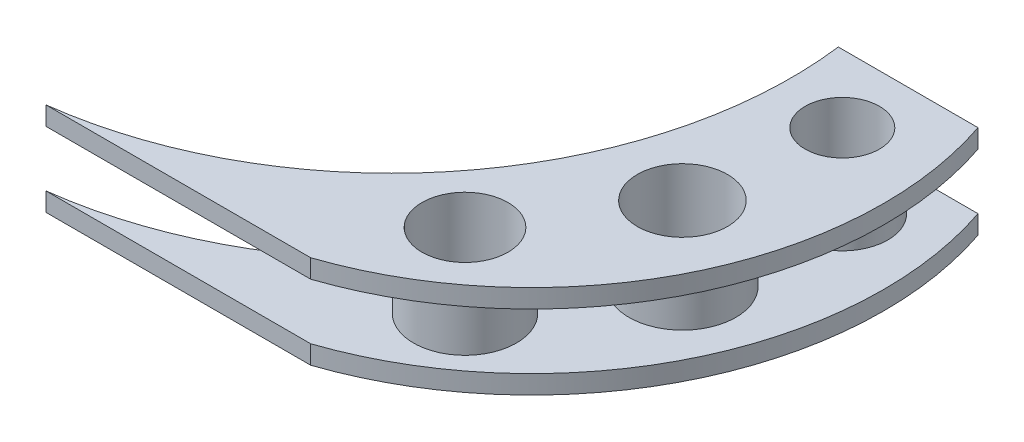
ISO-10303-21;
HEADER;
FILE_DESCRIPTION(('STEP AP214'),'2;1');
FILE_NAME('part.step','',(''),(''),'','','');
FILE_SCHEMA(('AUTOMOTIVE_DESIGN { 1 0 10303 214 1 1 1 1 }'));
ENDSEC;
DATA;
#1=APPLICATION_CONTEXT('core data for automotive mechanical design processes');
#2=APPLICATION_PROTOCOL_DEFINITION('international standard','automotive_design',2000,#1);
#3=PRODUCT_CONTEXT('',#1,'mechanical');
#4=PRODUCT('Part','Part','',(#3));
#5=PRODUCT_RELATED_PRODUCT_CATEGORY('part','',(#4));
#6=PRODUCT_DEFINITION_FORMATION('','',#4);
#7=PRODUCT_DEFINITION_CONTEXT('part definition',#1,'design');
#8=PRODUCT_DEFINITION('design','',#6,#7);
#9=PRODUCT_DEFINITION_SHAPE('','',#8);
#10=(LENGTH_UNIT() NAMED_UNIT(*) SI_UNIT(.MILLI.,.METRE.));
#11=(NAMED_UNIT(*) PLANE_ANGLE_UNIT() SI_UNIT($,.RADIAN.));
#12=(NAMED_UNIT(*) SI_UNIT($,.STERADIAN.) SOLID_ANGLE_UNIT());
#13=UNCERTAINTY_MEASURE_WITH_UNIT(LENGTH_MEASURE(1.E-05),#10,'distance_accuracy_value','');
#14=(GEOMETRIC_REPRESENTATION_CONTEXT(3) GLOBAL_UNCERTAINTY_ASSIGNED_CONTEXT((#13)) GLOBAL_UNIT_ASSIGNED_CONTEXT((#10,
#11,#12)) REPRESENTATION_CONTEXT('',''));
#15=CARTESIAN_POINT('',(0.,0.,0.));
#16=DIRECTION('',(0.,0.,1.));
#17=DIRECTION('',(1.,0.,0.));
#18=AXIS2_PLACEMENT_3D('',#15,#16,#17);
#19=CARTESIAN_POINT('',(-15.8234520425604,8.46666666666667,10.7767821999999));
#20=DIRECTION('',(0.,-1.,0.));
#21=DIRECTION('',(0.,0.,-1.));
#22=AXIS2_PLACEMENT_3D('',#19,#20,#21);
#23=PLANE('',#22);
#24=CARTESIAN_POINT('',(189.259581589069,8.46666666666667,83.8437988648439));
#25=DIRECTION('',(0.,-1.,0.));
#26=DIRECTION('',(0.,0.,-1.));
#27=AXIS2_PLACEMENT_3D('',#24,#25,#26);
#28=CIRCLE('',#27,24.3222874946335);
#29=CARTESIAN_POINT('',(189.259581589069,8.46666666666667,59.5215113702104));
#30=VERTEX_POINT('',#29);
#31=EDGE_CURVE('E60',#30,#30,#28,.F.);
#32=ORIENTED_EDGE('',*,*,#31,.F.);
#33=EDGE_LOOP('',(#32));
#34=FACE_BOUND('',#33,.T.);
#35=CARTESIAN_POINT('',(-15.8234520425604,8.46666666666667,10.7767821999999));
#36=DIRECTION('',(0.,-1.,0.));
#37=DIRECTION('',(0.,0.,-1.));
#38=AXIS2_PLACEMENT_3D('',#35,#36,#37);
#39=CIRCLE('',#38,181.522023150409);
#40=CARTESIAN_POINT('',(164.261221291976,8.46666666666667,-12.0213606763633));
#41=VERTEX_POINT('',#40);
#42=CARTESIAN_POINT('',(6.97469083380382,8.46666666666667,190.861455534536));
#43=VERTEX_POINT('',#42);
#44=EDGE_CURVE('E194',#41,#43,#39,.T.);
#45=ORIENTED_EDGE('',*,*,#44,.T.);
#46=DIRECTION('',(0.999999999999998,0.,6.39674270768674E-08));
#47=VECTOR('',#46,1.);
#48=CARTESIAN_POINT('',(6.97469083380382,8.46666666666667,190.861455534536));
#49=LINE('',#48,#47);
#50=CARTESIAN_POINT('',(127.314749354572,8.46666666666667,190.86146323238));
#51=VERTEX_POINT('',#50);
#52=EDGE_CURVE('E100',#43,#51,#49,.T.);
#53=ORIENTED_EDGE('',*,*,#52,.T.);
#54=CARTESIAN_POINT('',(76.0965733649999,8.46666666666667,39.1968153073744));
#55=DIRECTION('',(0.,1.,0.));
#56=DIRECTION('',(0.,0.,-1.));
#57=AXIS2_PLACEMENT_3D('',#54,#55,#56);
#58=CIRCLE('',#57,160.079564535623);
#59=CARTESIAN_POINT('',(227.761221291975,8.46666666666667,-12.0213606763633));
#60=VERTEX_POINT('',#59);
#61=EDGE_CURVE('E197',#51,#60,#58,.T.);
#62=ORIENTED_EDGE('',*,*,#61,.T.);
#63=DIRECTION('',(-1.,0.,0.));
#64=VECTOR('',#63,1.);
#65=CARTESIAN_POINT('',(164.261221291976,8.46666666666667,-12.0213606763633));
#66=LINE('',#65,#64);
#67=EDGE_CURVE('E68',#60,#41,#66,.T.);
#68=ORIENTED_EDGE('',*,*,#67,.T.);
#69=EDGE_LOOP('',(#45,#53,#62,#68));
#70=FACE_BOUND('',#69,.T.);
#71=CARTESIAN_POINT('',(150.41809926289,8.46666666666667,143.836583447852));
#72=DIRECTION('',(0.,-1.,0.));
#73=DIRECTION('',(0.,0.,-1.));
#74=AXIS2_PLACEMENT_3D('',#71,#72,#73);
#75=CIRCLE('',#74,23.3829417214132);
#76=CARTESIAN_POINT('',(150.41809926289,8.46666666666667,120.453641726439));
#77=VERTEX_POINT('',#76);
#78=EDGE_CURVE('E214',#77,#77,#75,.F.);
#79=ORIENTED_EDGE('',*,*,#78,.F.);
#80=EDGE_LOOP('',(#79));
#81=FACE_BOUND('',#80,.T.);
#82=CARTESIAN_POINT('',(196.950964227916,8.46666666666667,18.8516155665848));
#83=DIRECTION('',(0.,-1.,0.));
#84=DIRECTION('',(0.,0.,-1.));
#85=AXIS2_PLACEMENT_3D('',#82,#83,#84);
#86=CIRCLE('',#85,20.6953940850481);
#87=CARTESIAN_POINT('',(196.950964227916,8.46666666666667,-1.84377851846334));
#88=VERTEX_POINT('',#87);
#89=EDGE_CURVE('E12',#88,#88,#86,.F.);
#90=ORIENTED_EDGE('',*,*,#89,.F.);
#91=EDGE_LOOP('',(#90));
#92=FACE_BOUND('',#91,.T.);
#93=ADVANCED_FACE('F51',(#34,#70,#81,#92),#23,.F.);
#94=CARTESIAN_POINT('',(-15.8234520425604,8.46666666666667,10.7767821999999));
#95=DIRECTION('',(0.,-1.,0.));
#96=DIRECTION('',(0.,0.,-1.));
#97=AXIS2_PLACEMENT_3D('',#94,#95,#96);
#98=CYLINDRICAL_SURFACE('',#97,181.522023150409);
#99=CARTESIAN_POINT('',(-15.8234520425604,0.,10.7767821999999));
#100=DIRECTION('',(0.,-1.,0.));
#101=DIRECTION('',(0.,0.,-1.));
#102=AXIS2_PLACEMENT_3D('',#99,#100,#101);
#103=CIRCLE('',#102,181.522023150409);
#104=CARTESIAN_POINT('',(164.261221291976,0.,-12.0213606763633));
#105=VERTEX_POINT('',#104);
#106=CARTESIAN_POINT('',(6.97469083380382,0.,190.861455534536));
#107=VERTEX_POINT('',#106);
#108=EDGE_CURVE('E193',#105,#107,#103,.T.);
#109=ORIENTED_EDGE('',*,*,#108,.T.);
#110=DIRECTION('',(0.,-1.,0.));
#111=VECTOR('',#110,1.);
#112=CARTESIAN_POINT('',(6.97469083380382,8.46666666666667,190.861455534536));
#113=LINE('',#112,#111);
#114=EDGE_CURVE('E212',#43,#107,#113,.T.);
#115=ORIENTED_EDGE('',*,*,#114,.F.);
#116=ORIENTED_EDGE('',*,*,#44,.F.);
#117=DIRECTION('',(0.,-1.,0.));
#118=VECTOR('',#117,1.);
#119=CARTESIAN_POINT('',(164.261221291976,8.46666666666667,-12.0213606763633));
#120=LINE('',#119,#118);
#121=EDGE_CURVE('E200',#41,#105,#120,.T.);
#122=ORIENTED_EDGE('',*,*,#121,.T.);
#123=EDGE_LOOP('',(#109,#115,#116,#122));
#124=FACE_BOUND('',#123,.T.);
#125=ADVANCED_FACE('F53',(#124),#98,.F.);
#126=CARTESIAN_POINT('',(6.97469083380382,8.46666666666667,190.861455534536));
#127=DIRECTION('',(6.39674270768674E-08,0.,-0.999999999999998));
#128=DIRECTION('',(-0.999999999999998,0.,-6.39674270768674E-08));
#129=AXIS2_PLACEMENT_3D('',#126,#127,#128);
#130=PLANE('',#129);
#131=DIRECTION('',(0.999999999999998,0.,6.39674270768674E-08));
#132=VECTOR('',#131,1.);
#133=CARTESIAN_POINT('',(6.97469083380382,0.,190.861455534536));
#134=LINE('',#133,#132);
#135=CARTESIAN_POINT('',(127.314749354572,0.,190.86146323238));
#136=VERTEX_POINT('',#135);
#137=EDGE_CURVE('E203',#107,#136,#134,.T.);
#138=ORIENTED_EDGE('',*,*,#137,.T.);
#139=DIRECTION('',(0.,-1.,0.));
#140=VECTOR('',#139,1.);
#141=CARTESIAN_POINT('',(127.314749354572,8.46666666666667,190.86146323238));
#142=LINE('',#141,#140);
#143=EDGE_CURVE('E210',#51,#136,#142,.T.);
#144=ORIENTED_EDGE('',*,*,#143,.F.);
#145=ORIENTED_EDGE('',*,*,#52,.F.);
#146=ORIENTED_EDGE('',*,*,#114,.T.);
#147=EDGE_LOOP('',(#138,#144,#145,#146));
#148=FACE_BOUND('',#147,.T.);
#149=ADVANCED_FACE('F286',(#148),#130,.F.);
#150=CARTESIAN_POINT('',(76.0965733649999,8.46666666666667,39.1968153073744));
#151=DIRECTION('',(0.,-1.,0.));
#152=DIRECTION('',(0.,0.,-1.));
#153=AXIS2_PLACEMENT_3D('',#150,#151,#152);
#154=CYLINDRICAL_SURFACE('',#153,160.079564535623);
#155=CARTESIAN_POINT('',(76.0965733649999,0.,39.1968153073744));
#156=DIRECTION('',(0.,1.,0.));
#157=DIRECTION('',(0.,0.,-1.));
#158=AXIS2_PLACEMENT_3D('',#155,#156,#157);
#159=CIRCLE('',#158,160.079564535623);
#160=CARTESIAN_POINT('',(227.761221291975,0.,-12.0213606763633));
#161=VERTEX_POINT('',#160);
#162=EDGE_CURVE('E86',#136,#161,#159,.T.);
#163=ORIENTED_EDGE('',*,*,#162,.T.);
#164=DIRECTION('',(0.,-1.,0.));
#165=VECTOR('',#164,1.);
#166=CARTESIAN_POINT('',(227.761221291975,8.46666666666667,-12.0213606763633));
#167=LINE('',#166,#165);
#168=EDGE_CURVE('E208',#60,#161,#167,.T.);
#169=ORIENTED_EDGE('',*,*,#168,.F.);
#170=ORIENTED_EDGE('',*,*,#61,.F.);
#171=ORIENTED_EDGE('',*,*,#143,.T.);
#172=EDGE_LOOP('',(#163,#169,#170,#171));
#173=FACE_BOUND('',#172,.T.);
#174=ADVANCED_FACE('F284',(#173),#154,.T.);
#175=CARTESIAN_POINT('',(164.261221291976,8.46666666666667,-12.0213606763633));
#176=DIRECTION('',(0.,0.,1.));
#177=DIRECTION('',(1.,0.,0.));
#178=AXIS2_PLACEMENT_3D('',#175,#176,#177);
#179=PLANE('',#178);
#180=DIRECTION('',(-1.,0.,0.));
#181=VECTOR('',#180,1.);
#182=CARTESIAN_POINT('',(164.261221291976,0.,-12.0213606763633));
#183=LINE('',#182,#181);
#184=EDGE_CURVE('E92',#161,#105,#183,.T.);
#185=ORIENTED_EDGE('',*,*,#184,.T.);
#186=ORIENTED_EDGE('',*,*,#121,.F.);
#187=ORIENTED_EDGE('',*,*,#67,.F.);
#188=ORIENTED_EDGE('',*,*,#168,.T.);
#189=EDGE_LOOP('',(#185,#186,#187,#188));
#190=FACE_BOUND('',#189,.T.);
#191=ADVANCED_FACE('F280',(#190),#179,.F.);
#192=CARTESIAN_POINT('',(-15.8234520425604,0.,10.7767821999999));
#193=DIRECTION('',(0.,-1.,0.));
#194=DIRECTION('',(0.,0.,-1.));
#195=AXIS2_PLACEMENT_3D('',#192,#193,#194);
#196=PLANE('',#195);
#197=CARTESIAN_POINT('',(150.41809926289,0.,143.836583447852));
#198=DIRECTION('',(0.,1.,0.));
#199=DIRECTION('',(0.,0.,1.));
#200=AXIS2_PLACEMENT_3D('',#197,#198,#199);
#201=CIRCLE('',#200,19.5729417214132);
#202=CARTESIAN_POINT('',(150.41809926289,0.,163.409525169266));
#203=VERTEX_POINT('',#202);
#204=EDGE_CURVE('E184',#203,#203,#201,.T.);
#205=ORIENTED_EDGE('',*,*,#204,.T.);
#206=EDGE_LOOP('',(#205));
#207=FACE_BOUND('',#206,.T.);
#208=CARTESIAN_POINT('',(189.259581589069,0.,83.8437988648439));
#209=DIRECTION('',(0.,1.,0.));
#210=DIRECTION('',(0.,0.,1.));
#211=AXIS2_PLACEMENT_3D('',#208,#209,#210);
#212=CIRCLE('',#211,20.5122874946335);
#213=CARTESIAN_POINT('',(189.259581589069,0.,104.356086359477));
#214=VERTEX_POINT('',#213);
#215=EDGE_CURVE('E187',#214,#214,#212,.T.);
#216=ORIENTED_EDGE('',*,*,#215,.T.);
#217=EDGE_LOOP('',(#216));
#218=FACE_BOUND('',#217,.T.);
#219=CARTESIAN_POINT('',(196.950964227916,0.,18.8516155665848));
#220=DIRECTION('',(0.,1.,0.));
#221=DIRECTION('',(0.,0.,1.));
#222=AXIS2_PLACEMENT_3D('',#219,#220,#221);
#223=CIRCLE('',#222,16.8853940850481);
#224=CARTESIAN_POINT('',(196.950964227916,0.,35.7370096516329));
#225=VERTEX_POINT('',#224);
#226=EDGE_CURVE('E190',#225,#225,#223,.T.);
#227=ORIENTED_EDGE('',*,*,#226,.T.);
#228=EDGE_LOOP('',(#227));
#229=FACE_BOUND('',#228,.T.);
#230=ORIENTED_EDGE('',*,*,#108,.F.);
#231=ORIENTED_EDGE('',*,*,#184,.F.);
#232=ORIENTED_EDGE('',*,*,#162,.F.);
#233=ORIENTED_EDGE('',*,*,#137,.F.);
#234=EDGE_LOOP('',(#230,#231,#232,#233));
#235=FACE_BOUND('',#234,.T.);
#236=ADVANCED_FACE('F275',(#207,#218,#229,#235),#196,.T.);
#237=CARTESIAN_POINT('',(196.950964227916,0.,18.8516155665848));
#238=DIRECTION('',(0.,1.,0.));
#239=DIRECTION('',(0.,0.,1.));
#240=AXIS2_PLACEMENT_3D('',#237,#238,#239);
#241=CYLINDRICAL_SURFACE('',#240,16.8853940850481);
#242=ORIENTED_EDGE('',*,*,#226,.F.);
#243=EDGE_LOOP('',(#242));
#244=FACE_BOUND('',#243,.T.);
#245=CARTESIAN_POINT('',(196.950964227916,42.3333333333333,18.8516155665848));
#246=DIRECTION('',(0.,1.,0.));
#247=DIRECTION('',(0.,0.,1.));
#248=AXIS2_PLACEMENT_3D('',#245,#246,#247);
#249=CIRCLE('',#248,16.8853940850481);
#250=CARTESIAN_POINT('',(196.950964227916,42.3333333333333,35.7370096516329));
#251=VERTEX_POINT('',#250);
#252=EDGE_CURVE('E160',#251,#251,#249,.T.);
#253=ORIENTED_EDGE('',*,*,#252,.T.);
#254=EDGE_LOOP('',(#253));
#255=FACE_BOUND('',#254,.T.);
#256=ADVANCED_FACE('F272',(#244,#255),#241,.F.);
#257=CARTESIAN_POINT('',(189.259581589069,0.,83.8437988648439));
#258=DIRECTION('',(0.,1.,0.));
#259=DIRECTION('',(0.,0.,1.));
#260=AXIS2_PLACEMENT_3D('',#257,#258,#259);
#261=CYLINDRICAL_SURFACE('',#260,20.5122874946335);
#262=ORIENTED_EDGE('',*,*,#215,.F.);
#263=EDGE_LOOP('',(#262));
#264=FACE_BOUND('',#263,.T.);
#265=CARTESIAN_POINT('',(189.259581589069,42.3333333333333,83.8437988648439));
#266=DIRECTION('',(0.,1.,0.));
#267=DIRECTION('',(0.,0.,1.));
#268=AXIS2_PLACEMENT_3D('',#265,#266,#267);
#269=CIRCLE('',#268,20.5122874946335);
#270=CARTESIAN_POINT('',(189.259581589069,42.3333333333333,104.356086359477));
#271=VERTEX_POINT('',#270);
#272=EDGE_CURVE('E417',#271,#271,#269,.T.);
#273=ORIENTED_EDGE('',*,*,#272,.T.);
#274=EDGE_LOOP('',(#273));
#275=FACE_BOUND('',#274,.T.);
#276=ADVANCED_FACE('F268',(#264,#275),#261,.F.);
#277=CARTESIAN_POINT('',(150.41809926289,0.,143.836583447852));
#278=DIRECTION('',(0.,1.,0.));
#279=DIRECTION('',(0.,0.,1.));
#280=AXIS2_PLACEMENT_3D('',#277,#278,#279);
#281=CYLINDRICAL_SURFACE('',#280,19.5729417214132);
#282=ORIENTED_EDGE('',*,*,#204,.F.);
#283=EDGE_LOOP('',(#282));
#284=FACE_BOUND('',#283,.T.);
#285=CARTESIAN_POINT('',(150.41809926289,42.3333333333333,143.836583447852));
#286=DIRECTION('',(0.,1.,0.));
#287=DIRECTION('',(0.,0.,1.));
#288=AXIS2_PLACEMENT_3D('',#285,#286,#287);
#289=CIRCLE('',#288,19.5729417214132);
#290=CARTESIAN_POINT('',(150.41809926289,42.3333333333333,163.409525169266));
#291=VERTEX_POINT('',#290);
#292=EDGE_CURVE('E419',#291,#291,#289,.T.);
#293=ORIENTED_EDGE('',*,*,#292,.T.);
#294=EDGE_LOOP('',(#293));
#295=FACE_BOUND('',#294,.T.);
#296=ADVANCED_FACE('F264',(#284,#295),#281,.F.);
#297=CARTESIAN_POINT('',(150.41809926289,21.1666666666667,143.836583447852));
#298=DIRECTION('',(0.,-1.,0.));
#299=DIRECTION('',(0.,0.,-1.));
#300=AXIS2_PLACEMENT_3D('',#297,#298,#299);
#301=CYLINDRICAL_SURFACE('',#300,23.3829417214132);
#302=ORIENTED_EDGE('',*,*,#78,.T.);
#303=EDGE_LOOP('',(#302));
#304=FACE_BOUND('',#303,.T.);
#305=CARTESIAN_POINT('',(150.41809926289,33.8666666666667,143.836583447852));
#306=DIRECTION('',(0.,-1.,0.));
#307=DIRECTION('',(0.,0.,-1.));
#308=AXIS2_PLACEMENT_3D('',#305,#306,#307);
#309=CIRCLE('',#308,23.3829417214132);
#310=CARTESIAN_POINT('',(150.41809926289,33.8666666666667,120.453641726439));
#311=VERTEX_POINT('',#310);
#312=EDGE_CURVE('E139',#311,#311,#309,.F.);
#313=ORIENTED_EDGE('',*,*,#312,.F.);
#314=EDGE_LOOP('',(#313));
#315=FACE_BOUND('',#314,.T.);
#316=ADVANCED_FACE('F261',(#304,#315),#301,.T.);
#317=CARTESIAN_POINT('',(189.259581589069,21.1666666666667,83.8437988648439));
#318=DIRECTION('',(0.,-1.,0.));
#319=DIRECTION('',(0.,0.,-1.));
#320=AXIS2_PLACEMENT_3D('',#317,#318,#319);
#321=CYLINDRICAL_SURFACE('',#320,24.3222874946335);
#322=ORIENTED_EDGE('',*,*,#31,.T.);
#323=EDGE_LOOP('',(#322));
#324=FACE_BOUND('',#323,.T.);
#325=CARTESIAN_POINT('',(189.259581589069,33.8666666666667,83.8437988648439));
#326=DIRECTION('',(0.,-1.,0.));
#327=DIRECTION('',(0.,0.,-1.));
#328=AXIS2_PLACEMENT_3D('',#325,#326,#327);
#329=CIRCLE('',#328,24.3222874946335);
#330=CARTESIAN_POINT('',(189.259581589069,33.8666666666667,59.5215113702104));
#331=VERTEX_POINT('',#330);
#332=EDGE_CURVE('E178',#331,#331,#329,.F.);
#333=ORIENTED_EDGE('',*,*,#332,.F.);
#334=EDGE_LOOP('',(#333));
#335=FACE_BOUND('',#334,.T.);
#336=ADVANCED_FACE('F219',(#324,#335),#321,.T.);
#337=CARTESIAN_POINT('',(196.950964227916,21.1666666666667,18.8516155665848));
#338=DIRECTION('',(0.,-1.,0.));
#339=DIRECTION('',(0.,0.,-1.));
#340=AXIS2_PLACEMENT_3D('',#337,#338,#339);
#341=CYLINDRICAL_SURFACE('',#340,20.6953940850481);
#342=ORIENTED_EDGE('',*,*,#89,.T.);
#343=EDGE_LOOP('',(#342));
#344=FACE_BOUND('',#343,.T.);
#345=CARTESIAN_POINT('',(196.950964227916,33.8666666666667,18.8516155665848));
#346=DIRECTION('',(0.,-1.,0.));
#347=DIRECTION('',(0.,0.,-1.));
#348=AXIS2_PLACEMENT_3D('',#345,#346,#347);
#349=CIRCLE('',#348,20.6953940850481);
#350=CARTESIAN_POINT('',(196.950964227916,33.8666666666667,-1.84377851846334));
#351=VERTEX_POINT('',#350);
#352=EDGE_CURVE('E181',#351,#351,#349,.F.);
#353=ORIENTED_EDGE('',*,*,#352,.F.);
#354=EDGE_LOOP('',(#353));
#355=FACE_BOUND('',#354,.T.);
#356=ADVANCED_FACE('F231',(#344,#355),#341,.T.);
#357=CARTESIAN_POINT('',(-15.8234520425604,33.8666666666667,10.7767821999999));
#358=DIRECTION('',(0.,1.,0.));
#359=DIRECTION('',(0.,0.,-1.));
#360=AXIS2_PLACEMENT_3D('',#357,#358,#359);
#361=PLANE('',#360);
#362=ORIENTED_EDGE('',*,*,#332,.T.);
#363=EDGE_LOOP('',(#362));
#364=FACE_BOUND('',#363,.T.);
#365=CARTESIAN_POINT('',(-15.8234520425604,33.8666666666667,10.7767821999999));
#366=DIRECTION('',(0.,-1.,0.));
#367=DIRECTION('',(0.,0.,-1.));
#368=AXIS2_PLACEMENT_3D('',#365,#366,#367);
#369=CIRCLE('',#368,181.522023150409);
#370=CARTESIAN_POINT('',(164.261221291976,33.8666666666667,-12.0213606763633));
#371=VERTEX_POINT('',#370);
#372=CARTESIAN_POINT('',(6.97469083380382,33.8666666666667,190.861455534536));
#373=VERTEX_POINT('',#372);
#374=EDGE_CURVE('E147',#371,#373,#369,.T.);
#375=ORIENTED_EDGE('',*,*,#374,.F.);
#376=DIRECTION('',(-1.,0.,0.));
#377=VECTOR('',#376,1.);
#378=CARTESIAN_POINT('',(164.261221291976,33.8666666666667,-12.0213606763633));
#379=LINE('',#378,#377);
#380=CARTESIAN_POINT('',(227.761221291975,33.8666666666667,-12.0213606763633));
#381=VERTEX_POINT('',#380);
#382=EDGE_CURVE('E164',#381,#371,#379,.T.);
#383=ORIENTED_EDGE('',*,*,#382,.F.);
#384=CARTESIAN_POINT('',(76.0965733649999,33.8666666666667,39.1968153073744));
#385=DIRECTION('',(0.,1.,0.));
#386=DIRECTION('',(0.,0.,-1.));
#387=AXIS2_PLACEMENT_3D('',#384,#385,#386);
#388=CIRCLE('',#387,160.079564535623);
#389=CARTESIAN_POINT('',(127.314749354572,33.8666666666667,190.86146323238));
#390=VERTEX_POINT('',#389);
#391=EDGE_CURVE('E149',#390,#381,#388,.T.);
#392=ORIENTED_EDGE('',*,*,#391,.F.);
#393=DIRECTION('',(0.999999999999998,0.,6.39674270768674E-08));
#394=VECTOR('',#393,1.);
#395=CARTESIAN_POINT('',(6.97469083380382,33.8666666666667,190.861455534536));
#396=LINE('',#395,#394);
#397=EDGE_CURVE('E131',#373,#390,#396,.T.);
#398=ORIENTED_EDGE('',*,*,#397,.F.);
#399=EDGE_LOOP('',(#375,#383,#392,#398));
#400=FACE_BOUND('',#399,.T.);
#401=ORIENTED_EDGE('',*,*,#312,.T.);
#402=EDGE_LOOP('',(#401));
#403=FACE_BOUND('',#402,.T.);
#404=ORIENTED_EDGE('',*,*,#352,.T.);
#405=EDGE_LOOP('',(#404));
#406=FACE_BOUND('',#405,.T.);
#407=ADVANCED_FACE('F144',(#364,#400,#403,#406),#361,.F.);
#408=CARTESIAN_POINT('',(-15.8234520425604,33.8666666666667,10.7767821999999));
#409=DIRECTION('',(0.,1.,0.));
#410=DIRECTION('',(0.,0.,-1.));
#411=AXIS2_PLACEMENT_3D('',#408,#409,#410);
#412=CYLINDRICAL_SURFACE('',#411,181.522023150409);
#413=CARTESIAN_POINT('',(-15.8234520425604,42.3333333333333,10.7767821999999));
#414=DIRECTION('',(0.,-1.,0.));
#415=DIRECTION('',(0.,0.,-1.));
#416=AXIS2_PLACEMENT_3D('',#413,#414,#415);
#417=CIRCLE('',#416,181.522023150409);
#418=CARTESIAN_POINT('',(164.261221291976,42.3333333333333,-12.0213606763633));
#419=VERTEX_POINT('',#418);
#420=CARTESIAN_POINT('',(6.97469083380382,42.3333333333333,190.861455534536));
#421=VERTEX_POINT('',#420);
#422=EDGE_CURVE('E166',#419,#421,#417,.T.);
#423=ORIENTED_EDGE('',*,*,#422,.F.);
#424=DIRECTION('',(0.,1.,0.));
#425=VECTOR('',#424,1.);
#426=CARTESIAN_POINT('',(164.261221291976,33.8666666666667,-12.0213606763633));
#427=LINE('',#426,#425);
#428=EDGE_CURVE('E153',#371,#419,#427,.T.);
#429=ORIENTED_EDGE('',*,*,#428,.F.);
#430=ORIENTED_EDGE('',*,*,#374,.T.);
#431=DIRECTION('',(0.,1.,0.));
#432=VECTOR('',#431,1.);
#433=CARTESIAN_POINT('',(6.97469083380382,33.8666666666667,190.861455534536));
#434=LINE('',#433,#432);
#435=EDGE_CURVE('E127',#373,#421,#434,.T.);
#436=ORIENTED_EDGE('',*,*,#435,.T.);
#437=EDGE_LOOP('',(#423,#429,#430,#436));
#438=FACE_BOUND('',#437,.T.);
#439=ADVANCED_FACE('F151',(#438),#412,.F.);
#440=CARTESIAN_POINT('',(6.97469083380382,33.8666666666667,190.861455534536));
#441=DIRECTION('',(6.39674270768674E-08,0.,-0.999999999999998));
#442=DIRECTION('',(-0.999999999999998,0.,-6.39674270768674E-08));
#443=AXIS2_PLACEMENT_3D('',#440,#441,#442);
#444=PLANE('',#443);
#445=DIRECTION('',(0.999999999999998,0.,6.39674270768674E-08));
#446=VECTOR('',#445,1.);
#447=CARTESIAN_POINT('',(6.97469083380382,42.3333333333333,190.861455534536));
#448=LINE('',#447,#446);
#449=CARTESIAN_POINT('',(127.314749354572,42.3333333333333,190.86146323238));
#450=VERTEX_POINT('',#449);
#451=EDGE_CURVE('E134',#421,#450,#448,.T.);
#452=ORIENTED_EDGE('',*,*,#451,.F.);
#453=ORIENTED_EDGE('',*,*,#435,.F.);
#454=ORIENTED_EDGE('',*,*,#397,.T.);
#455=DIRECTION('',(0.,1.,0.));
#456=VECTOR('',#455,1.);
#457=CARTESIAN_POINT('',(127.314749354572,33.8666666666667,190.86146323238));
#458=LINE('',#457,#456);
#459=EDGE_CURVE('E140',#390,#450,#458,.T.);
#460=ORIENTED_EDGE('',*,*,#459,.T.);
#461=EDGE_LOOP('',(#452,#453,#454,#460));
#462=FACE_BOUND('',#461,.T.);
#463=ADVANCED_FACE('F129',(#462),#444,.F.);
#464=CARTESIAN_POINT('',(76.0965733649999,33.8666666666667,39.1968153073744));
#465=DIRECTION('',(0.,1.,0.));
#466=DIRECTION('',(0.,0.,-1.));
#467=AXIS2_PLACEMENT_3D('',#464,#465,#466);
#468=CYLINDRICAL_SURFACE('',#467,160.079564535623);
#469=CARTESIAN_POINT('',(76.0965733649999,42.3333333333333,39.1968153073744));
#470=DIRECTION('',(0.,1.,0.));
#471=DIRECTION('',(0.,0.,-1.));
#472=AXIS2_PLACEMENT_3D('',#469,#470,#471);
#473=CIRCLE('',#472,160.079564535623);
#474=CARTESIAN_POINT('',(227.761221291975,42.3333333333333,-12.0213606763633));
#475=VERTEX_POINT('',#474);
#476=EDGE_CURVE('E157',#450,#475,#473,.T.);
#477=ORIENTED_EDGE('',*,*,#476,.F.);
#478=ORIENTED_EDGE('',*,*,#459,.F.);
#479=ORIENTED_EDGE('',*,*,#391,.T.);
#480=DIRECTION('',(0.,1.,0.));
#481=VECTOR('',#480,1.);
#482=CARTESIAN_POINT('',(227.761221291975,33.8666666666667,-12.0213606763633));
#483=LINE('',#482,#481);
#484=EDGE_CURVE('E172',#381,#475,#483,.T.);
#485=ORIENTED_EDGE('',*,*,#484,.T.);
#486=EDGE_LOOP('',(#477,#478,#479,#485));
#487=FACE_BOUND('',#486,.T.);
#488=ADVANCED_FACE('F252',(#487),#468,.T.);
#489=CARTESIAN_POINT('',(164.261221291976,33.8666666666667,-12.0213606763633));
#490=DIRECTION('',(0.,0.,1.));
#491=DIRECTION('',(1.,0.,0.));
#492=AXIS2_PLACEMENT_3D('',#489,#490,#491);
#493=PLANE('',#492);
#494=DIRECTION('',(-1.,0.,0.));
#495=VECTOR('',#494,1.);
#496=CARTESIAN_POINT('',(164.261221291976,42.3333333333333,-12.0213606763633));
#497=LINE('',#496,#495);
#498=EDGE_CURVE('E155',#475,#419,#497,.T.);
#499=ORIENTED_EDGE('',*,*,#498,.F.);
#500=ORIENTED_EDGE('',*,*,#484,.F.);
#501=ORIENTED_EDGE('',*,*,#382,.T.);
#502=ORIENTED_EDGE('',*,*,#428,.T.);
#503=EDGE_LOOP('',(#499,#500,#501,#502));
#504=FACE_BOUND('',#503,.T.);
#505=ADVANCED_FACE('F248',(#504),#493,.F.);
#506=CARTESIAN_POINT('',(-15.8234520425604,42.3333333333333,10.7767821999999));
#507=DIRECTION('',(0.,1.,0.));
#508=DIRECTION('',(0.,0.,-1.));
#509=AXIS2_PLACEMENT_3D('',#506,#507,#508);
#510=PLANE('',#509);
#511=ORIENTED_EDGE('',*,*,#292,.F.);
#512=EDGE_LOOP('',(#511));
#513=FACE_BOUND('',#512,.T.);
#514=ORIENTED_EDGE('',*,*,#272,.F.);
#515=EDGE_LOOP('',(#514));
#516=FACE_BOUND('',#515,.T.);
#517=ORIENTED_EDGE('',*,*,#252,.F.);
#518=EDGE_LOOP('',(#517));
#519=FACE_BOUND('',#518,.T.);
#520=ORIENTED_EDGE('',*,*,#422,.T.);
#521=ORIENTED_EDGE('',*,*,#451,.T.);
#522=ORIENTED_EDGE('',*,*,#476,.T.);
#523=ORIENTED_EDGE('',*,*,#498,.T.);
#524=EDGE_LOOP('',(#520,#521,#522,#523));
#525=FACE_BOUND('',#524,.T.);
#526=ADVANCED_FACE('F245',(#513,#516,#519,#525),#510,.T.);
#527=CLOSED_SHELL('',(#93,#125,#149,#174,#191,#236,#256,#276,#296,#316,#336,#356,#407,#439,#463,
#488,#505,#526));
#528=MANIFOLD_SOLID_BREP('B2',#527);
#529=ADVANCED_BREP_SHAPE_REPRESENTATION('',(#18,#528),#14);
#530=SHAPE_DEFINITION_REPRESENTATION(#9,#529);
ENDSEC;
END-ISO-10303-21;
